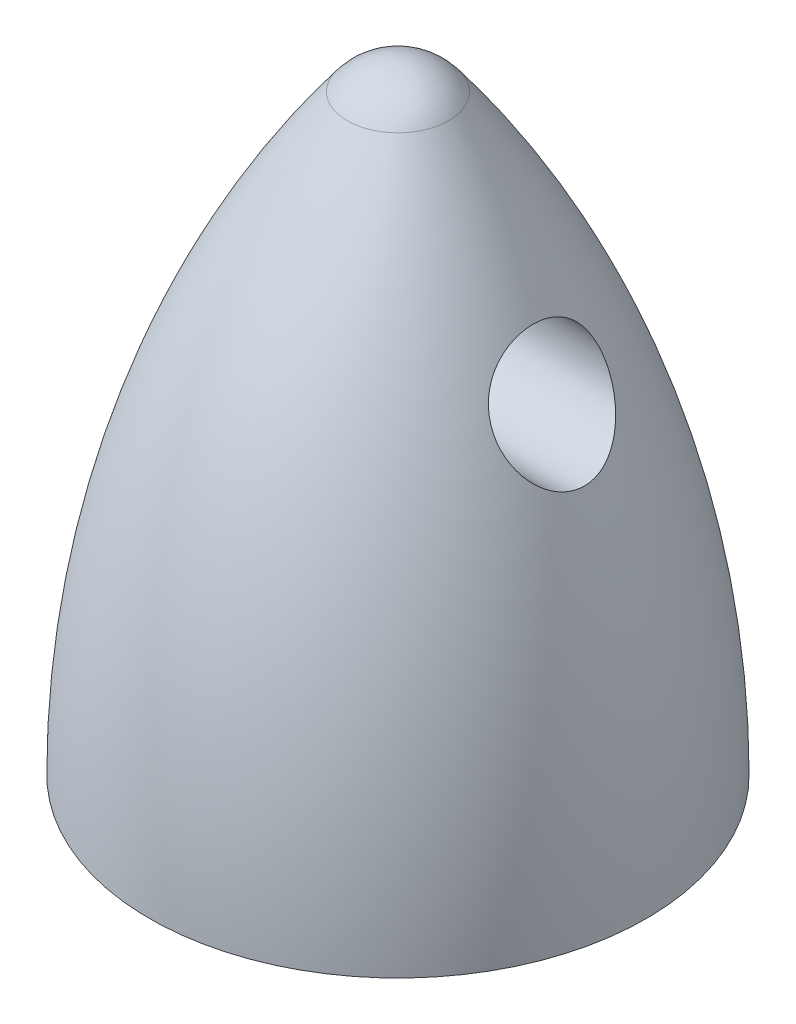
ISO-10303-21;
HEADER;
FILE_DESCRIPTION(('STEP AP214'),'2;1');
FILE_NAME('part.step','',(''),(''),'','','');
FILE_SCHEMA(('AUTOMOTIVE_DESIGN { 1 0 10303 214 1 1 1 1 }'));
ENDSEC;
DATA;
#1=APPLICATION_CONTEXT('core data for automotive mechanical design processes');
#2=APPLICATION_PROTOCOL_DEFINITION('international standard','automotive_design',2000,#1);
#3=PRODUCT_CONTEXT('',#1,'mechanical');
#4=PRODUCT('Part','Part','',(#3));
#5=PRODUCT_RELATED_PRODUCT_CATEGORY('part','',(#4));
#6=PRODUCT_DEFINITION_FORMATION('','',#4);
#7=PRODUCT_DEFINITION_CONTEXT('part definition',#1,'design');
#8=PRODUCT_DEFINITION('design','',#6,#7);
#9=PRODUCT_DEFINITION_SHAPE('','',#8);
#10=(LENGTH_UNIT() NAMED_UNIT(*) SI_UNIT(.MILLI.,.METRE.));
#11=(NAMED_UNIT(*) PLANE_ANGLE_UNIT() SI_UNIT($,.RADIAN.));
#12=(NAMED_UNIT(*) SI_UNIT($,.STERADIAN.) SOLID_ANGLE_UNIT());
#13=UNCERTAINTY_MEASURE_WITH_UNIT(LENGTH_MEASURE(1.E-05),#10,'distance_accuracy_value','');
#14=(GEOMETRIC_REPRESENTATION_CONTEXT(3) GLOBAL_UNCERTAINTY_ASSIGNED_CONTEXT((#13)) GLOBAL_UNIT_ASSIGNED_CONTEXT((#10,
#11,#12)) REPRESENTATION_CONTEXT('',''));
#15=CARTESIAN_POINT('',(0.,0.,0.));
#16=DIRECTION('',(0.,0.,1.));
#17=DIRECTION('',(1.,0.,0.));
#18=AXIS2_PLACEMENT_3D('',#15,#16,#17);
#19=CARTESIAN_POINT('',(0.,0.,0.));
#20=DIRECTION('',(0.,-1.,0.));
#21=DIRECTION('',(0.,0.,-1.));
#22=AXIS2_PLACEMENT_3D('',#19,#20,#21);
#23=PLANE('',#22);
#24=CARTESIAN_POINT('',(0.,0.,0.));
#25=DIRECTION('',(0.,-1.,0.));
#26=DIRECTION('',(0.,0.,-1.));
#27=AXIS2_PLACEMENT_3D('',#24,#25,#26);
#28=CIRCLE('',#27,5.28293515659564);
#29=CARTESIAN_POINT('',(0.,0.,-5.28293515659564));
#30=VERTEX_POINT('',#29);
#31=EDGE_CURVE('E61',#30,#30,#28,.T.);
#32=ORIENTED_EDGE('',*,*,#31,.F.);
#33=EDGE_LOOP('',(#32));
#34=FACE_BOUND('',#33,.T.);
#35=CARTESIAN_POINT('',(0.,0.,0.));
#36=DIRECTION('',(0.,-1.,0.));
#37=DIRECTION('',(0.,0.,-1.));
#38=AXIS2_PLACEMENT_3D('',#35,#36,#37);
#39=CIRCLE('',#38,6.5);
#40=CARTESIAN_POINT('',(0.,0.,-6.5));
#41=VERTEX_POINT('',#40);
#42=EDGE_CURVE('E11',#41,#41,#39,.T.);
#43=ORIENTED_EDGE('',*,*,#42,.T.);
#44=EDGE_LOOP('',(#43));
#45=FACE_BOUND('',#44,.T.);
#46=ADVANCED_FACE('F34',(#34,#45),#23,.T.);
#47=CARTESIAN_POINT('',(0.,0.,0.));
#48=DIRECTION('',(0.,-1.,0.));
#49=DIRECTION('',(0.,0.,-1.));
#50=AXIS2_PLACEMENT_3D('',#47,#48,#49);
#51=DEGENERATE_TOROIDAL_SURFACE('',#50,19.3065316847898,25.8065316847898,.F.);
#52=CARTESIAN_POINT('',(-4.68185864713295,9.29753634875941,-0.896706363640182));
#53=CARTESIAN_POINT('',(-4.71018365651269,9.2539641722539,-0.838280490306642));
#54=CARTESIAN_POINT('',(-4.73635738737989,9.21416686222692,-0.776020483125367));
#55=CARTESIAN_POINT('',(-4.78312699573284,9.14355499488466,-0.644671685181425));
#56=CARTESIAN_POINT('',(-4.80372757675631,9.11273286115542,-0.575588720399161));
#57=CARTESIAN_POINT('',(-4.83819964851719,9.06138394436156,-0.431577769976058));
#58=CARTESIAN_POINT('',(-4.8520302634293,9.04091967557426,-0.35661737410127));
#59=CARTESIAN_POINT('',(-4.87173504461825,9.0118160046204,-0.203412124631232));
#60=CARTESIAN_POINT('',(-4.87761281424203,9.00317124714429,-0.12516877508555));
#61=CARTESIAN_POINT('',(-4.88080061853756,8.99847995814565,0.0254464422884936));
#62=CARTESIAN_POINT('',(-4.8787709989508,9.00146244948933,0.0977761120093008));
#63=CARTESIAN_POINT('',(-4.86775516316866,9.01769514171347,0.240718399184072));
#64=CARTESIAN_POINT('',(-4.85876930964893,9.03094480729656,0.311331105957002));
#65=CARTESIAN_POINT('',(-4.83470997896133,9.06659085905802,0.447419768409899));
#66=CARTESIAN_POINT('',(-4.81977108219787,9.08878515229278,0.512973374810838));
#67=CARTESIAN_POINT('',(-4.78465951525524,9.14129669226365,0.63922166709291));
#68=CARTESIAN_POINT('',(-4.76448543847987,9.17161612214562,0.699915041375563));
#69=CARTESIAN_POINT('',(-4.71765242044077,9.24261209030221,0.82121215593018));
#70=CARTESIAN_POINT('',(-4.6905502699978,9.28401495834463,0.881217321420633));
#71=CARTESIAN_POINT('',(-4.63242507380469,9.37389533479751,0.99351354269224));
#72=CARTESIAN_POINT('',(-4.60139992070278,9.42237664777601,1.04580041941175));
#73=CARTESIAN_POINT('',(-4.53133681588059,9.53351343506424,1.15004656053923));
#74=CARTESIAN_POINT('',(-4.49181413575115,9.59719343640045,1.20058801895171));
#75=CARTESIAN_POINT('',(-4.41064023345174,9.73088123898225,1.29032862350953));
#76=CARTESIAN_POINT('',(-4.36898760018894,9.80089325942261,1.3295201327119));
#77=CARTESIAN_POINT('',(-4.27892128786591,9.95645979347997,1.40104058667037));
#78=CARTESIAN_POINT('',(-4.23040290818316,10.0427960514472,1.43155078578877));
#79=CARTESIAN_POINT('',(-4.13456797574963,10.2202597033681,1.47652644560755));
#80=CARTESIAN_POINT('',(-4.08725213907051,10.3113898571673,1.49098255571163));
#81=CARTESIAN_POINT('',(-3.99435939048944,10.4996088096355,1.50305954930859));
#82=CARTESIAN_POINT('',(-3.94889659734289,10.5967948411191,1.50009025234773));
#83=CARTESIAN_POINT('',(-3.86384224424085,10.7912087938961,1.4747128062988));
#84=CARTESIAN_POINT('',(-3.82424455510253,10.8884365634391,1.45232512013289));
#85=CARTESIAN_POINT('',(-3.75658298105276,11.0690473500288,1.3907955048907));
#86=CARTESIAN_POINT('',(-3.72774669640705,11.1528163151447,1.35364581240044));
#87=CARTESIAN_POINT('',(-3.67711932977314,11.3136752879187,1.26349048814004));
#88=CARTESIAN_POINT('',(-3.65532214005982,11.3907710430752,1.21049867966773));
#89=CARTESIAN_POINT('',(-3.6208008784214,11.5259664916053,1.09736631254657));
#90=CARTESIAN_POINT('',(-3.6073013106026,11.585235608869,1.03884979944025));
#91=CARTESIAN_POINT('',(-3.58489496037475,11.693594299009,0.912286856940033));
#92=CARTESIAN_POINT('',(-3.57598777186955,11.7426847717355,0.844241270862432));
#93=CARTESIAN_POINT('',(-3.56195825729425,11.827708092437,0.702718970070315));
#94=CARTESIAN_POINT('',(-3.55673471831455,11.8639778892274,0.629453960840905));
#95=CARTESIAN_POINT('',(-3.54871414487148,11.9241716850841,0.477895103950528));
#96=CARTESIAN_POINT('',(-3.54591717903529,11.9480953349748,0.399601114129611));
#97=CARTESIAN_POINT('',(-3.54198491006167,11.9832144691849,0.238697376886722));
#98=CARTESIAN_POINT('',(-3.54088022556,11.9941746182195,0.156035481884885));
#99=CARTESIAN_POINT('',(-3.54005396624772,12.0022675765359,-0.00997325663228543));
#100=CARTESIAN_POINT('',(-3.54033250377131,11.9993992627814,-0.0933201552293544));
#101=CARTESIAN_POINT('',(-3.54238159164984,11.9798252780839,-0.259130825832074));
#102=CARTESIAN_POINT('',(-3.544165734933,11.9629935661476,-0.341579596944496));
#103=CARTESIAN_POINT('',(-3.54981478578982,11.9158277828592,-0.502450995218726));
#104=CARTESIAN_POINT('',(-3.55367970968587,11.8854936055893,-0.580873590792503));
#105=CARTESIAN_POINT('',(-3.56439217088674,11.8124155344454,-0.731104455550985));
#106=CARTESIAN_POINT('',(-3.5712277278824,11.7697217144728,-0.802937903471389));
#107=CARTESIAN_POINT('',(-3.58892218791287,11.6733104846955,-0.938209326230631));
#108=CARTESIAN_POINT('',(-3.59978006850469,11.6195958778348,-1.00164942903488));
#109=CARTESIAN_POINT('',(-3.6261662953308,11.504118267769,-1.1172749161335));
#110=CARTESIAN_POINT('',(-3.64160742162635,11.4425168167842,-1.16964168092369));
#111=CARTESIAN_POINT('',(-3.67765809152351,11.3127537201685,-1.26326303195997));
#112=CARTESIAN_POINT('',(-3.69826738654528,11.2445923901533,-1.30451815245873));
#113=CARTESIAN_POINT('',(-3.74458340354667,11.1039666742254,-1.37529312192712));
#114=CARTESIAN_POINT('',(-3.77029592141261,11.0314974618825,-1.40479951189356));
#115=CARTESIAN_POINT('',(-3.82623011126502,10.8844845221393,-1.45194286558845));
#116=CARTESIAN_POINT('',(-3.85645338010364,10.8099400677152,-1.46957561369194));
#117=CARTESIAN_POINT('',(-3.92295266173672,10.6549357572091,-1.49419284876178));
#118=CARTESIAN_POINT('',(-3.95951377799034,10.5744556637879,-1.50026927086903));
#119=CARTESIAN_POINT('',(-4.03555530224905,10.4149549459987,-1.49971204086733));
#120=CARTESIAN_POINT('',(-4.07503680267808,10.3359348817371,-1.49307360917918));
#121=CARTESIAN_POINT('',(-4.16077072576978,10.1707793632653,-1.46611038628218));
#122=CARTESIAN_POINT('',(-4.20724385438243,10.085024289139,-1.44414572352796));
#123=CARTESIAN_POINT('',(-4.30042832755589,9.91867250281249,-1.38558570201567));
#124=CARTESIAN_POINT('',(-4.3471399069979,9.83808281517242,-1.34897089015504));
#125=CARTESIAN_POINT('',(-4.44559142603913,9.67247442915354,-1.25520463168826));
#126=CARTESIAN_POINT('',(-4.49706393333441,9.58853995357525,-1.19582864959987));
#127=CARTESIAN_POINT('',(-4.59450103058032,9.43291176465379,-1.05924270949114));
#128=CARTESIAN_POINT('',(-4.64047581293733,9.36119529169908,-0.98206655528151));
#129=CARTESIAN_POINT('',(-4.68185864713295,9.29753634875941,-0.896706363640182));
#130=B_SPLINE_CURVE_WITH_KNOTS('',3,(#52,#53,#54,#55,#56,#57,#58,#59,#60,#61,#62,#63,#64,#65,
#66,#67,#68,#69,#70,#71,#72,#73,#74,#75,#76,#77,#78,#79,#80,#81,#82,#83,#84,#85,#86,#87,#88,#89,
#90,#91,#92,#93,#94,#95,#96,#97,#98,#99,#100,#101,#102,#103,#104,#105,#106,#107,#108,#109,#110,
#111,#112,#113,#114,#115,#116,#117,#118,#119,#120,#121,#122,#123,#124,#125,#126,#127,#128,#129),
.UNSPECIFIED.,.T.,.F.,(4,2,2,2,2,2,2,2,2,2,2,2,2,2,2,2,2,2,2,2,2,2,2,2,2,2,2,2,2,2,2,2,2,2,2,2,
2,2,4),(0.,0.23429749098625,0.468396622050208,0.703892282233753,0.939281206146591,
1.15545137806929,1.37161028033405,1.58313703350115,1.7947206789514,2.02716082652908,
2.25972637061622,2.52986660905461,2.80018819435278,3.10970154973946,3.41939508470682,
3.73963682212666,4.05954150114823,4.34606183425467,4.63233288545583,4.88420656547288,
5.13605796891552,5.3806870745022,5.62532309834576,5.87433514899115,6.12336742273069,
6.37467236781642,6.62597928425579,6.87628197235129,7.12652107908268,7.37227399976631,
7.6180151024331,7.86403691455481,8.11014602842002,8.37490310454286,8.63975972375044,
8.93844688854817,9.23753198634524,9.58048659301771,9.9227951900582),.UNSPECIFIED.);
#131=CARTESIAN_POINT('',(-4.68185864713295,9.29753634875941,-0.896706363640182));
#132=VERTEX_POINT('',#131);
#133=EDGE_CURVE('E37',#132,#132,#130,.T.);
#134=ORIENTED_EDGE('',*,*,#133,.F.);
#135=EDGE_LOOP('',(#134));
#136=FACE_BOUND('',#135,.T.);
#137=CARTESIAN_POINT('',(3.59437873549332,11.6477782690151,-0.965714784590737));
#138=CARTESIAN_POINT('',(3.58355942475012,11.7006952322232,-0.902824325195955));
#139=CARTESIAN_POINT('',(3.5749546451688,11.7486038777981,-0.835351569976127));
#140=CARTESIAN_POINT('',(3.56118368465982,11.8327887121197,-0.693181156809963));
#141=CARTESIAN_POINT('',(3.55601790438596,11.869063545237,-0.61848265820338));
#142=CARTESIAN_POINT('',(3.54814325093108,11.9288048592697,-0.464075604478865));
#143=CARTESIAN_POINT('',(3.54543265241826,11.952280330066,-0.384370609765341));
#144=CARTESIAN_POINT('',(3.54171880623977,11.9857697377191,-0.222145506435262));
#145=CARTESIAN_POINT('',(3.54071557757092,11.9957835247959,-0.139625366506802));
#146=CARTESIAN_POINT('',(3.5400723821833,12.0020926998821,0.0267590819003273));
#147=CARTESIAN_POINT('',(3.54044592997988,11.9982521002802,0.110628626352487));
#148=CARTESIAN_POINT('',(3.54272101816801,11.9766594627914,0.276542126574127));
#149=CARTESIAN_POINT('',(3.54462264666423,11.9589066227667,0.3585859767991));
#150=CARTESIAN_POINT('',(3.55055643408731,11.9099658881742,0.518665719707619));
#151=CARTESIAN_POINT('',(3.55459277484231,11.8787516454103,0.596693414501462));
#152=CARTESIAN_POINT('',(3.56573740655485,11.8038627910009,0.746280816909286));
#153=CARTESIAN_POINT('',(3.57284528927346,11.7601898355061,0.817841382542255));
#154=CARTESIAN_POINT('',(3.59107615267641,11.6624498155499,0.951570423344806));
#155=CARTESIAN_POINT('',(3.60214992266076,11.6085137856743,1.01384130985991));
#156=CARTESIAN_POINT('',(3.62916698611823,11.4918439923173,1.1282364677245));
#157=CARTESIAN_POINT('',(3.64510916420432,11.4291122457759,1.18036305873037));
#158=CARTESIAN_POINT('',(3.68198420463225,11.2981650029698,1.27249543300212));
#159=CARTESIAN_POINT('',(3.70283571911791,11.2300497957599,1.31267687584296));
#160=CARTESIAN_POINT('',(3.74952443574826,11.0897911966838,1.38139434751828));
#161=CARTESIAN_POINT('',(3.77536262177255,11.0176470118923,1.4099280747702));
#162=CARTESIAN_POINT('',(3.83248166271892,10.8687180476517,1.45614333711175));
#163=CARTESIAN_POINT('',(3.86392961555184,10.7918605548459,1.4733802583297));
#164=CARTESIAN_POINT('',(3.93057536341527,10.6380215392653,1.49566022510404));
#165=CARTESIAN_POINT('',(3.96577475334696,10.5610399775518,1.50069806252838));
#166=CARTESIAN_POINT('',(4.04293312509768,10.3998369278545,1.49905922699421));
#167=CARTESIAN_POINT('',(4.08520643795636,10.3157806609521,1.4909940369002));
#168=CARTESIAN_POINT('',(4.1714363568552,10.1509995336686,1.46123844851226));
#169=CARTESIAN_POINT('',(4.21539392588425,10.0702766356673,1.43954014281555));
#170=CARTESIAN_POINT('',(4.30851825538285,9.90448040750461,1.37985154718439));
#171=CARTESIAN_POINT('',(4.35769943850902,9.81998387592341,1.34026709499109));
#172=CARTESIAN_POINT('',(4.45397825120541,9.65880729334095,1.2454482209085));
#173=CARTESIAN_POINT('',(4.50107430642993,9.58213309337182,1.19020219934238));
#174=CARTESIAN_POINT('',(4.59088392795159,9.43869049390089,1.06431791527296));
#175=CARTESIAN_POINT('',(4.63357564639505,9.37197080739511,0.993607883311567));
#176=CARTESIAN_POINT('',(4.71133884016273,9.25206231182677,0.837998408198608));
#177=CARTESIAN_POINT('',(4.74642822542405,9.1988416494448,0.753133166891972));
#178=CARTESIAN_POINT('',(4.79709402500158,9.1226312271004,0.598299782987203));
#179=CARTESIAN_POINT('',(4.81537364750593,9.09535435667318,0.531306364150087));
#180=CARTESIAN_POINT('',(4.84553772349117,9.0505131698303,0.39277579931832));
#181=CARTESIAN_POINT('',(4.85742718826875,9.03294124229402,0.321242263150985));
#182=CARTESIAN_POINT('',(4.87403492317395,9.00843106686969,0.175267812504705));
#183=CARTESIAN_POINT('',(4.87872649701384,9.00153240430542,0.100817119987112));
#184=CARTESIAN_POINT('',(4.88049740372082,8.9989260067675,-0.0483742303818229));
#185=CARTESIAN_POINT('',(4.87757722674775,9.00321755119876,-0.123114869252551));
#186=CARTESIAN_POINT('',(4.86475611224407,9.02211972595899,-0.265988078119808));
#187=CARTESIAN_POINT('',(4.8552884275675,9.03609000613841,-0.334246790985672));
#188=CARTESIAN_POINT('',(4.83043874254024,9.07293524125829,-0.467167571638555));
#189=CARTESIAN_POINT('',(4.81505595445708,9.09581138222461,-0.531829159071923));
#190=CARTESIAN_POINT('',(4.77832518493186,9.15080542275544,-0.659343597484706));
#191=CARTESIAN_POINT('',(4.7567185713378,9.18332638120235,-0.721946539165845));
#192=CARTESIAN_POINT('',(4.70899688127143,9.25582796505092,-0.840765700280233));
#193=CARTESIAN_POINT('',(4.6828798251278,9.29581186662632,-0.896979097248233));
#194=CARTESIAN_POINT('',(4.62323807804443,9.38819254048175,-1.00991834110452));
#195=CARTESIAN_POINT('',(4.58918812780059,9.44154575527969,-1.06558273292047));
#196=CARTESIAN_POINT('',(4.51803530379968,9.5549252257913,-1.16732377649187));
#197=CARTESIAN_POINT('',(4.48093060133457,9.61495548633517,-1.21339462603572));
#198=CARTESIAN_POINT('',(4.39873431330597,9.75072140339322,-1.30238324253429));
#199=CARTESIAN_POINT('',(4.35332974443951,9.82741921936022,-1.34354960403366));
#200=CARTESIAN_POINT('',(4.26198071397052,9.98651577853257,-1.41203560091684));
#201=CARTESIAN_POINT('',(4.21603586876409,10.0689188043445,-1.43934470345106));
#202=CARTESIAN_POINT('',(4.12110886301846,10.2458588839112,-1.48136355775727));
#203=CARTESIAN_POINT('',(4.07224853251216,10.340807599077,-1.49464333933809));
#204=CARTESIAN_POINT('',(3.97836310892323,10.5334066298287,-1.50271849139817));
#205=CARTESIAN_POINT('',(3.93333714060206,10.6310563221062,-1.49751809184045));
#206=CARTESIAN_POINT('',(3.85148188234469,10.8212398476821,-1.46819469162902));
#207=CARTESIAN_POINT('',(3.81435807495828,10.9137887285077,-1.44501647209442));
#208=CARTESIAN_POINT('',(3.74735605998008,11.0949786245704,-1.38029563820564));
#209=CARTESIAN_POINT('',(3.7174675079167,11.1836250689951,-1.33877948511248));
#210=CARTESIAN_POINT('',(3.6699683033401,11.3388309064548,-1.2462513287817));
#211=CARTESIAN_POINT('',(3.65114743364745,11.406626852907,-1.19791817381062));
#212=CARTESIAN_POINT('',(3.61890160782249,11.533962818905,-1.08989994171325));
#213=CARTESIAN_POINT('',(3.6054754072514,11.5935047404057,-1.03021748732137));
#214=CARTESIAN_POINT('',(3.59437873549332,11.6477782690151,-0.965714784590737));
#215=B_SPLINE_CURVE_WITH_KNOTS('',3,(#137,#138,#139,#140,#141,#142,#143,#144,#145,#146,#147,
#148,#149,#150,#151,#152,#153,#154,#155,#156,#157,#158,#159,#160,#161,#162,#163,#164,#165,#166,
#167,#168,#169,#170,#171,#172,#173,#174,#175,#176,#177,#178,#179,#180,#181,#182,#183,#184,#185,
#186,#187,#188,#189,#190,#191,#192,#193,#194,#195,#196,#197,#198,#199,#200,#201,#202,#203,#204,
#205,#206,#207,#208,#209,#210,#211,#212,#213,#214),.UNSPECIFIED.,.T.,.F.,(4,2,2,2,2,2,2,2,2,2,2,
2,2,2,2,2,2,2,2,2,2,2,2,2,2,2,2,2,2,2,2,2,2,2,2,2,2,2,4),(0.,0.248388470634376,
0.496805874213079,0.745048571490716,0.993294030788501,1.24398274227442,1.49468590877549,
1.74588202328682,1.99704476156259,2.24519318759295,2.49328480364782,2.73752366631008,
2.98181076711033,3.23521219336548,3.48872178475934,3.77088682202465,4.05321567033549,
4.36820104530298,4.68342032514443,5.00013483581943,5.31609490060783,5.53899089900945,
5.76171184165875,5.98525685488692,6.20878747325529,6.41878753225454,6.62881556729716,
6.84928952031302,7.06986048828654,7.32176303823596,7.5738175001452,7.86714230874677,
8.16068973968663,8.48190224476561,8.80304123165316,9.10836033748081,9.41324030610196,
9.66805521280662,9.922811305181),.UNSPECIFIED.);
#216=CARTESIAN_POINT('',(3.59437873549332,11.6477782690151,-0.965714784590737));
#217=VERTEX_POINT('',#216);
#218=EDGE_CURVE('E64',#217,#217,#215,.T.);
#219=ORIENTED_EDGE('',*,*,#218,.F.);
#220=EDGE_LOOP('',(#219));
#221=FACE_BOUND('',#220,.T.);
#222=CARTESIAN_POINT('',(0.,15.5021606975133,0.));
#223=DIRECTION('',(0.,-1.,0.));
#224=DIRECTION('',(0.,0.,-1.));
#225=AXIS2_PLACEMENT_3D('',#222,#223,#224);
#226=CIRCLE('',#225,1.32499979754406);
#227=CARTESIAN_POINT('',(0.,15.5021606975133,-1.32499979754406));
#228=VERTEX_POINT('',#227);
#229=EDGE_CURVE('E45',#228,#228,#226,.T.);
#230=ORIENTED_EDGE('',*,*,#229,.T.);
#231=EDGE_LOOP('',(#230));
#232=FACE_BOUND('',#231,.T.);
#233=ORIENTED_EDGE('',*,*,#42,.F.);
#234=EDGE_LOOP('',(#233));
#235=FACE_BOUND('',#234,.T.);
#236=ADVANCED_FACE('F53',(#136,#221,#232,#235),#51,.F.);
#237=CARTESIAN_POINT('',(0.,14.4960690066313,0.0139885408929619));
#238=DIRECTION('',(-1.,0.,0.));
#239=DIRECTION('',(0.,0.,-1.));
#240=AXIS2_PLACEMENT_3D('',#237,#238,#239);
#241=CIRCLE('',#240,1.67484633949871);
#242=TRIMMED_CURVE('',#241,(PARAMETER_VALUE(-1.56244409578484)),
(PARAMETER_VALUE(1.56244409578484)),.T.,.PARAMETER.);
#243=CARTESIAN_POINT('',(0.,14.4960690066313,0.));
#244=DIRECTION('',(0.,-1.,0.));
#245=AXIS1_PLACEMENT('',#243,#244);
#246=SURFACE_OF_REVOLUTION('',#242,#245);
#247=CARTESIAN_POINT('',(0.,16.1708569280279,0.));
#248=VERTEX_POINT('',#247);
#249=VERTEX_LOOP('',#248);
#250=FACE_BOUND('',#249,.T.);
#251=ORIENTED_EDGE('',*,*,#229,.F.);
#252=EDGE_LOOP('',(#251));
#253=FACE_BOUND('',#252,.T.);
#254=ADVANCED_FACE('F49',(#250,#253),#246,.T.);
#255=CARTESIAN_POINT('',(0.,3.8,0.));
#256=DIRECTION('',(0.,-1.,0.));
#257=DIRECTION('',(0.,0.,-1.));
#258=AXIS2_PLACEMENT_3D('',#255,#256,#257);
#259=CYLINDRICAL_SURFACE('',#258,5.28293515659564);
#260=CARTESIAN_POINT('',(0.,3.8,0.));
#261=DIRECTION('',(0.,-1.,0.));
#262=DIRECTION('',(0.,0.,-1.));
#263=AXIS2_PLACEMENT_3D('',#260,#261,#262);
#264=CIRCLE('',#263,5.28293515659564);
#265=CARTESIAN_POINT('',(0.,3.8,-5.28293515659564));
#266=VERTEX_POINT('',#265);
#267=EDGE_CURVE('E58',#266,#266,#264,.T.);
#268=CARTESIAN_POINT('',(0.,3.8,-5.28293515659564));
#269=CARTESIAN_POINT('',(0.,3.76041666666667,-5.28293515659564));
#270=CARTESIAN_POINT('',(0.,3.72083333333333,-5.28293515659564));
#271=CARTESIAN_POINT('',(0.,3.64166666666667,-5.28293515659564));
#272=CARTESIAN_POINT('',(0.,3.60208333333333,-5.28293515659564));
#273=CARTESIAN_POINT('',(0.,3.52291666666667,-5.28293515659564));
#274=CARTESIAN_POINT('',(0.,3.48333333333333,-5.28293515659564));
#275=CARTESIAN_POINT('',(0.,3.40416666666667,-5.28293515659564));
#276=CARTESIAN_POINT('',(0.,3.36458333333333,-5.28293515659564));
#277=CARTESIAN_POINT('',(0.,3.28541666666667,-5.28293515659564));
#278=CARTESIAN_POINT('',(0.,3.24583333333333,-5.28293515659564));
#279=CARTESIAN_POINT('',(0.,3.16666666666667,-5.28293515659564));
#280=CARTESIAN_POINT('',(0.,3.12708333333333,-5.28293515659564));
#281=CARTESIAN_POINT('',(0.,3.04791666666667,-5.28293515659564));
#282=CARTESIAN_POINT('',(0.,3.00833333333333,-5.28293515659564));
#283=CARTESIAN_POINT('',(0.,2.92916666666667,-5.28293515659564));
#284=CARTESIAN_POINT('',(0.,2.88958333333333,-5.28293515659564));
#285=CARTESIAN_POINT('',(0.,2.81041666666667,-5.28293515659564));
#286=CARTESIAN_POINT('',(0.,2.77083333333333,-5.28293515659564));
#287=CARTESIAN_POINT('',(0.,2.69166666666667,-5.28293515659564));
#288=CARTESIAN_POINT('',(0.,2.65208333333333,-5.28293515659564));
#289=CARTESIAN_POINT('',(0.,2.57291666666667,-5.28293515659564));
#290=CARTESIAN_POINT('',(0.,2.53333333333333,-5.28293515659564));
#291=CARTESIAN_POINT('',(0.,2.45416666666667,-5.28293515659564));
#292=CARTESIAN_POINT('',(0.,2.41458333333333,-5.28293515659564));
#293=CARTESIAN_POINT('',(0.,2.33541666666667,-5.28293515659564));
#294=CARTESIAN_POINT('',(0.,2.29583333333333,-5.28293515659564));
#295=CARTESIAN_POINT('',(0.,2.21666666666667,-5.28293515659564));
#296=CARTESIAN_POINT('',(0.,2.17708333333333,-5.28293515659564));
#297=CARTESIAN_POINT('',(0.,2.09791666666667,-5.28293515659564));
#298=CARTESIAN_POINT('',(0.,2.05833333333333,-5.28293515659564));
#299=CARTESIAN_POINT('',(0.,1.97916666666667,-5.28293515659564));
#300=CARTESIAN_POINT('',(0.,1.93958333333333,-5.28293515659564));
#301=CARTESIAN_POINT('',(0.,1.86041666666667,-5.28293515659564));
#302=CARTESIAN_POINT('',(0.,1.82083333333333,-5.28293515659564));
#303=CARTESIAN_POINT('',(0.,1.74166666666667,-5.28293515659564));
#304=CARTESIAN_POINT('',(0.,1.70208333333333,-5.28293515659564));
#305=CARTESIAN_POINT('',(0.,1.62291666666667,-5.28293515659564));
#306=CARTESIAN_POINT('',(0.,1.58333333333333,-5.28293515659564));
#307=CARTESIAN_POINT('',(0.,1.50416666666667,-5.28293515659564));
#308=CARTESIAN_POINT('',(0.,1.46458333333333,-5.28293515659564));
#309=CARTESIAN_POINT('',(0.,1.38541666666667,-5.28293515659564));
#310=CARTESIAN_POINT('',(0.,1.34583333333333,-5.28293515659564));
#311=CARTESIAN_POINT('',(0.,1.26666666666667,-5.28293515659564));
#312=CARTESIAN_POINT('',(0.,1.22708333333333,-5.28293515659564));
#313=CARTESIAN_POINT('',(0.,1.14791666666667,-5.28293515659564));
#314=CARTESIAN_POINT('',(0.,1.10833333333333,-5.28293515659564));
#315=CARTESIAN_POINT('',(0.,1.02916666666667,-5.28293515659564));
#316=CARTESIAN_POINT('',(0.,0.989583333333334,-5.28293515659564));
#317=CARTESIAN_POINT('',(0.,0.910416666666667,-5.28293515659564));
#318=CARTESIAN_POINT('',(0.,0.870833333333334,-5.28293515659564));
#319=CARTESIAN_POINT('',(0.,0.791666666666667,-5.28293515659564));
#320=CARTESIAN_POINT('',(0.,0.752083333333333,-5.28293515659564));
#321=CARTESIAN_POINT('',(0.,0.672916666666667,-5.28293515659564));
#322=CARTESIAN_POINT('',(0.,0.633333333333333,-5.28293515659564));
#323=CARTESIAN_POINT('',(0.,0.554166666666667,-5.28293515659564));
#324=CARTESIAN_POINT('',(0.,0.514583333333334,-5.28293515659564));
#325=CARTESIAN_POINT('',(0.,0.435416666666667,-5.28293515659564));
#326=CARTESIAN_POINT('',(0.,0.395833333333334,-5.28293515659564));
#327=CARTESIAN_POINT('',(0.,0.316666666666667,-5.28293515659564));
#328=CARTESIAN_POINT('',(0.,0.277083333333333,-5.28293515659564));
#329=CARTESIAN_POINT('',(0.,0.197916666666667,-5.28293515659564));
#330=CARTESIAN_POINT('',(0.,0.158333333333333,-5.28293515659564));
#331=CARTESIAN_POINT('',(0.,0.0791666666666666,-5.28293515659564));
#332=CARTESIAN_POINT('',(0.,0.0395833333333333,-5.28293515659564));
#333=CARTESIAN_POINT('',(0.,0.,-5.28293515659564));
#334=B_SPLINE_CURVE_WITH_KNOTS('',3,(#268,#269,#270,#271,#272,#273,#274,#275,#276,#277,#278,
#279,#280,#281,#282,#283,#284,#285,#286,#287,#288,#289,#290,#291,#292,#293,#294,#295,#296,#297,
#298,#299,#300,#301,#302,#303,#304,#305,#306,#307,#308,#309,#310,#311,#312,#313,#314,#315,#316,
#317,#318,#319,#320,#321,#322,#323,#324,#325,#326,#327,#328,#329,#330,#331,#332,#333),
.UNSPECIFIED.,.F.,.F.,(4,2,2,2,2,2,2,2,2,2,2,2,2,2,2,2,2,2,2,2,2,2,2,2,2,2,2,2,2,2,2,2,4),(0.,
0.11875,0.2375,0.35625,0.475,0.59375,0.7125,0.83125,0.95,1.06875,1.1875,1.30625,1.425,1.54375,
1.6625,1.78125,1.9,2.01875,2.1375,2.25625,2.375,2.49375,2.6125,2.73125,2.85,2.96875,3.0875,
3.20625,3.325,3.44375,3.5625,3.68125,3.8),.UNSPECIFIED.);
#335=EDGE_CURVE('BSEAM52',#266,#30,#334,.T.);
#336=ORIENTED_EDGE('',*,*,#267,.F.);
#337=ORIENTED_EDGE('',*,*,#31,.T.);
#338=ORIENTED_EDGE('',*,*,#335,.T.);
#339=ORIENTED_EDGE('',*,*,#335,.F.);
#340=EDGE_LOOP('',(#336,#338,#337,#339));
#341=FACE_BOUND('',#340,.T.);
#342=ADVANCED_FACE('F52',(#341),#259,.F.);
#343=CARTESIAN_POINT('',(0.,3.8,0.));
#344=DIRECTION('',(0.,-1.,0.));
#345=DIRECTION('',(0.,0.,-1.));
#346=AXIS2_PLACEMENT_3D('',#343,#344,#345);
#347=PLANE('',#346);
#348=ORIENTED_EDGE('',*,*,#267,.T.);
#349=EDGE_LOOP('',(#348));
#350=FACE_BOUND('',#349,.T.);
#351=ADVANCED_FACE('F74',(#350),#347,.T.);
#352=CARTESIAN_POINT('',(-6.5,10.5,0.));
#353=DIRECTION('',(1.,0.,0.));
#354=DIRECTION('',(0.,0.,-1.));
#355=AXIS2_PLACEMENT_3D('',#352,#353,#354);
#356=CYLINDRICAL_SURFACE('',#355,1.5);
#357=ORIENTED_EDGE('',*,*,#133,.T.);
#358=EDGE_LOOP('',(#357));
#359=FACE_BOUND('',#358,.T.);
#360=ORIENTED_EDGE('',*,*,#218,.T.);
#361=EDGE_LOOP('',(#360));
#362=FACE_BOUND('',#361,.T.);
#363=ADVANCED_FACE('F70',(#359,#362),#356,.F.);
#364=CLOSED_SHELL('',(#46,#236,#254,#342,#351,#363));
#365=MANIFOLD_SOLID_BREP('B2',#364);
#366=ADVANCED_BREP_SHAPE_REPRESENTATION('',(#18,#365),#14);
#367=SHAPE_DEFINITION_REPRESENTATION(#9,#366);
ENDSEC;
END-ISO-10303-21;
